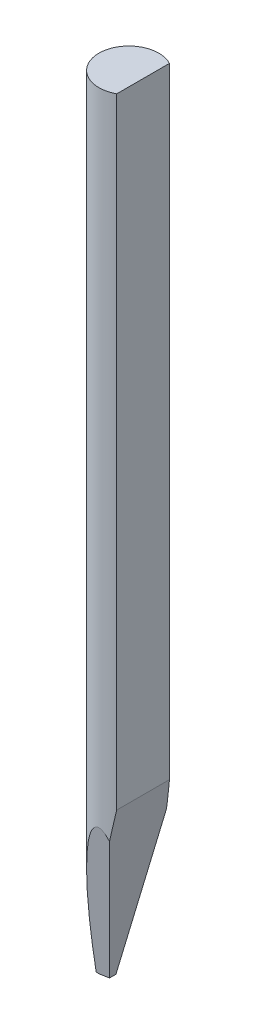
ISO-10303-21;
HEADER;
FILE_DESCRIPTION(('STEP AP214'),'2;1');
FILE_NAME('part.step','',(''),(''),'','','');
FILE_SCHEMA(('AUTOMOTIVE_DESIGN { 1 0 10303 214 1 1 1 1 }'));
ENDSEC;
DATA;
#1=APPLICATION_CONTEXT('core data for automotive mechanical design processes');
#2=APPLICATION_PROTOCOL_DEFINITION('international standard','automotive_design',2000,#1);
#3=PRODUCT_CONTEXT('',#1,'mechanical');
#4=PRODUCT('Part','Part','',(#3));
#5=PRODUCT_RELATED_PRODUCT_CATEGORY('part','',(#4));
#6=PRODUCT_DEFINITION_FORMATION('','',#4);
#7=PRODUCT_DEFINITION_CONTEXT('part definition',#1,'design');
#8=PRODUCT_DEFINITION('design','',#6,#7);
#9=PRODUCT_DEFINITION_SHAPE('','',#8);
#10=(LENGTH_UNIT() NAMED_UNIT(*) SI_UNIT(.MILLI.,.METRE.));
#11=(NAMED_UNIT(*) PLANE_ANGLE_UNIT() SI_UNIT($,.RADIAN.));
#12=(NAMED_UNIT(*) SI_UNIT($,.STERADIAN.) SOLID_ANGLE_UNIT());
#13=UNCERTAINTY_MEASURE_WITH_UNIT(LENGTH_MEASURE(1.E-05),#10,'distance_accuracy_value','');
#14=(GEOMETRIC_REPRESENTATION_CONTEXT(3) GLOBAL_UNCERTAINTY_ASSIGNED_CONTEXT((#13)) GLOBAL_UNIT_ASSIGNED_CONTEXT((#10,
#11,#12)) REPRESENTATION_CONTEXT('',''));
#15=CARTESIAN_POINT('',(0.,0.,0.));
#16=DIRECTION('',(0.,0.,1.));
#17=DIRECTION('',(1.,0.,0.));
#18=AXIS2_PLACEMENT_3D('',#15,#16,#17);
#19=CARTESIAN_POINT('',(0.,0.,0.));
#20=DIRECTION('',(0.,1.,0.));
#21=DIRECTION('',(0.,0.,1.));
#22=AXIS2_PLACEMENT_3D('',#19,#20,#21);
#23=PLANE('',#22);
#24=DIRECTION('',(0.,0.,-1.));
#25=VECTOR('',#24,1.);
#26=CARTESIAN_POINT('',(-0.71628,0.,26.4992219491216));
#27=LINE('',#26,#25);
#28=CARTESIAN_POINT('',(-0.71628,0.,0.0762));
#29=VERTEX_POINT('',#28);
#30=CARTESIAN_POINT('',(-0.71628,0.,-0.0762));
#31=VERTEX_POINT('',#30);
#32=EDGE_CURVE('E114',#29,#31,#27,.T.);
#33=ORIENTED_EDGE('',*,*,#32,.F.);
#34=DIRECTION('',(-1.,0.,0.));
#35=VECTOR('',#34,1.);
#36=CARTESIAN_POINT('',(26.8738719491216,0.,0.0762));
#37=LINE('',#36,#35);
#38=CARTESIAN_POINT('',(-0.788808031399274,0.,0.0762));
#39=VERTEX_POINT('',#38);
#40=EDGE_CURVE('E144',#29,#39,#37,.T.);
#41=ORIENTED_EDGE('',*,*,#40,.T.);
#42=CARTESIAN_POINT('',(0.,0.,0.));
#43=DIRECTION('',(0.,1.,0.));
#44=DIRECTION('',(0.,0.,1.));
#45=AXIS2_PLACEMENT_3D('',#42,#43,#44);
#46=CIRCLE('',#45,0.792479999999998);
#47=CARTESIAN_POINT('',(-0.788808031399274,0.,-0.0762));
#48=VERTEX_POINT('',#47);
#49=EDGE_CURVE('E127',#48,#39,#46,.T.);
#50=ORIENTED_EDGE('',*,*,#49,.F.);
#51=DIRECTION('',(-1.,0.,0.));
#52=VECTOR('',#51,1.);
#53=CARTESIAN_POINT('',(26.8738719491216,0.,-0.0762));
#54=LINE('',#53,#52);
#55=EDGE_CURVE('E102',#31,#48,#54,.T.);
#56=ORIENTED_EDGE('',*,*,#55,.F.);
#57=EDGE_LOOP('',(#33,#41,#50,#56));
#58=FACE_BOUND('',#57,.T.);
#59=ADVANCED_FACE('F42',(#58),#23,.F.);
#60=CARTESIAN_POINT('',(0.,21.0312,0.));
#61=DIRECTION('',(0.,-1.,0.));
#62=DIRECTION('',(0.,0.,-1.));
#63=AXIS2_PLACEMENT_3D('',#60,#61,#62);
#64=CYLINDRICAL_SURFACE('',#63,0.792479999999998);
#65=CARTESIAN_POINT('',(0.,-0.432151674654869,0.));
#66=DIRECTION('',(0.,-0.173648177666931,0.984807753012208));
#67=DIRECTION('',(0.,-0.984807753012208,-0.173648177666931));
#68=AXIS2_PLACEMENT_3D('',#65,#66,#67);
#69=ELLIPSE('',#68,4.56371043248163,0.792479999999998);
#70=CARTESIAN_POINT('',(0.241656250086243,3.84817029906569,0.754736250086248));
#71=VERTEX_POINT('',#70);
#72=EDGE_CURVE('E106',#71,#39,#69,.T.);
#73=ORIENTED_EDGE('',*,*,#72,.F.);
#74=CARTESIAN_POINT('',(0.,2.47766960135458,0.));
#75=DIRECTION('',(-0.984807753012208,0.173648177666931,0.));
#76=DIRECTION('',(-0.173648177666931,-0.984807753012208,0.));
#77=AXIS2_PLACEMENT_3D('',#74,#75,#76);
#78=ELLIPSE('',#77,4.56371043248165,0.792479999999998);
#79=CARTESIAN_POINT('',(0.37592,4.60961786298526,0.69764511322018));
#80=VERTEX_POINT('',#79);
#81=EDGE_CURVE('E58',#71,#80,#78,.T.);
#82=ORIENTED_EDGE('',*,*,#81,.T.);
#83=DIRECTION('',(0.,-1.,0.));
#84=VECTOR('',#83,1.);
#85=CARTESIAN_POINT('',(0.37592,21.0312,0.69764511322018));
#86=LINE('',#85,#84);
#87=CARTESIAN_POINT('',(0.37592,21.0312,0.69764511322018));
#88=VERTEX_POINT('',#87);
#89=EDGE_CURVE('E131',#88,#80,#86,.T.);
#90=ORIENTED_EDGE('',*,*,#89,.F.);
#91=CARTESIAN_POINT('',(0.,21.0312,0.));
#92=DIRECTION('',(0.,1.,0.));
#93=DIRECTION('',(0.,0.,1.));
#94=AXIS2_PLACEMENT_3D('',#91,#92,#93);
#95=CIRCLE('',#94,0.792479999999998);
#96=CARTESIAN_POINT('',(0.37592,21.0312,-0.69764511322018));
#97=VERTEX_POINT('',#96);
#98=EDGE_CURVE('E122',#97,#88,#95,.T.);
#99=ORIENTED_EDGE('',*,*,#98,.F.);
#100=DIRECTION('',(0.,-1.,0.));
#101=VECTOR('',#100,1.);
#102=CARTESIAN_POINT('',(0.37592,21.0312,-0.69764511322018));
#103=LINE('',#102,#101);
#104=CARTESIAN_POINT('',(0.37592,4.60961786298526,-0.69764511322018));
#105=VERTEX_POINT('',#104);
#106=EDGE_CURVE('E111',#105,#97,#103,.F.);
#107=ORIENTED_EDGE('',*,*,#106,.F.);
#108=CARTESIAN_POINT('',(0.241656250086243,3.84817029906569,-0.754736250086248));
#109=VERTEX_POINT('',#108);
#110=EDGE_CURVE('E109',#105,#109,#78,.T.);
#111=ORIENTED_EDGE('',*,*,#110,.T.);
#112=CARTESIAN_POINT('',(0.,-0.432151674654869,0.));
#113=DIRECTION('',(0.,-0.173648177666931,-0.984807753012208));
#114=DIRECTION('',(0.,-0.984807753012208,0.173648177666931));
#115=AXIS2_PLACEMENT_3D('',#112,#113,#114);
#116=ELLIPSE('',#115,4.56371043248163,0.792479999999998);
#117=EDGE_CURVE('E97',#48,#109,#116,.T.);
#118=ORIENTED_EDGE('',*,*,#117,.F.);
#119=ORIENTED_EDGE('',*,*,#49,.T.);
#120=EDGE_LOOP('',(#73,#82,#90,#99,#107,#111,#118,#119));
#121=FACE_BOUND('',#120,.T.);
#122=ADVANCED_FACE('F44',(#121),#64,.T.);
#123=CARTESIAN_POINT('',(0.37592,21.0312,0.80247998));
#124=DIRECTION('',(1.,0.,0.));
#125=DIRECTION('',(0.,0.,-1.));
#126=AXIS2_PLACEMENT_3D('',#123,#124,#125);
#127=PLANE('',#126);
#128=DIRECTION('',(0.,0.,1.));
#129=VECTOR('',#128,1.);
#130=CARTESIAN_POINT('',(0.37592,4.60961786298526,0.80247998));
#131=LINE('',#130,#129);
#132=EDGE_CURVE('E65',#105,#80,#131,.T.);
#133=ORIENTED_EDGE('',*,*,#132,.F.);
#134=ORIENTED_EDGE('',*,*,#106,.T.);
#135=DIRECTION('',(0.,0.,1.));
#136=VECTOR('',#135,1.);
#137=CARTESIAN_POINT('',(0.37592,21.0312,0.80247998));
#138=LINE('',#137,#136);
#139=EDGE_CURVE('E105',#97,#88,#138,.T.);
#140=ORIENTED_EDGE('',*,*,#139,.T.);
#141=ORIENTED_EDGE('',*,*,#89,.T.);
#142=EDGE_LOOP('',(#133,#134,#140,#141));
#143=FACE_BOUND('',#142,.T.);
#144=ADVANCED_FACE('F185',(#143),#127,.T.);
#145=CARTESIAN_POINT('',(0.,21.0312,0.));
#146=DIRECTION('',(0.,1.,0.));
#147=DIRECTION('',(0.,0.,1.));
#148=AXIS2_PLACEMENT_3D('',#145,#146,#147);
#149=PLANE('',#148);
#150=ORIENTED_EDGE('',*,*,#98,.T.);
#151=ORIENTED_EDGE('',*,*,#139,.F.);
#152=EDGE_LOOP('',(#150,#151));
#153=FACE_BOUND('',#152,.T.);
#154=ADVANCED_FACE('F178',(#153),#149,.T.);
#155=CARTESIAN_POINT('',(26.8738719491216,0.,0.0762));
#156=DIRECTION('',(0.,-0.173648177666931,0.984807753012208));
#157=DIRECTION('',(0.,-0.984807753012208,-0.173648177666931));
#158=AXIS2_PLACEMENT_3D('',#155,#156,#157);
#159=PLANE('',#158);
#160=DIRECTION('',(-0.984346441568213,-0.173566836012846,-0.0306045161452665));
#161=VECTOR('',#160,1.);
#162=CARTESIAN_POINT('',(26.016864360068,4.71377462985435,0.907365648222384));
#163=LINE('',#162,#161);
#164=CARTESIAN_POINT('',(-0.427914365185118,0.0508466417269895,0.0851656348148848));
#165=VERTEX_POINT('',#164);
#166=EDGE_CURVE('E148',#165,#29,#163,.T.);
#167=ORIENTED_EDGE('',*,*,#166,.F.);
#168=DIRECTION('',(-0.171087869746036,-0.970287525247814,-0.171087869746036));
#169=VECTOR('',#168,1.);
#170=CARTESIAN_POINT('',(0.362534636395632,4.53370569372685,0.875614636395637));
#171=LINE('',#170,#169);
#172=EDGE_CURVE('E152',#71,#165,#171,.T.);
#173=ORIENTED_EDGE('',*,*,#172,.F.);
#174=ORIENTED_EDGE('',*,*,#72,.T.);
#175=ORIENTED_EDGE('',*,*,#40,.F.);
#176=EDGE_LOOP('',(#167,#173,#174,#175));
#177=FACE_BOUND('',#176,.T.);
#178=ADVANCED_FACE('F176',(#177),#159,.T.);
#179=CARTESIAN_POINT('',(26.8738719491216,0.,-0.0762));
#180=DIRECTION('',(0.,-0.173648177666931,-0.984807753012208));
#181=DIRECTION('',(0.,0.984807753012208,-0.173648177666931));
#182=AXIS2_PLACEMENT_3D('',#179,#180,#181);
#183=PLANE('',#182);
#184=DIRECTION('',(0.984346441568213,0.173566836012846,-0.0306045161452665));
#185=VECTOR('',#184,1.);
#186=CARTESIAN_POINT('',(26.016864360068,4.71377462985435,-0.907365648222384));
#187=LINE('',#186,#185);
#188=CARTESIAN_POINT('',(-0.427914365185118,0.0508466417269895,-0.0851656348148848));
#189=VERTEX_POINT('',#188);
#190=EDGE_CURVE('E11',#31,#189,#187,.T.);
#191=ORIENTED_EDGE('',*,*,#190,.F.);
#192=ORIENTED_EDGE('',*,*,#55,.T.);
#193=ORIENTED_EDGE('',*,*,#117,.T.);
#194=DIRECTION('',(0.171087869746036,0.970287525247814,-0.171087869746036));
#195=VECTOR('',#194,1.);
#196=CARTESIAN_POINT('',(0.362534636395632,4.53370569372685,-0.875614636395637));
#197=LINE('',#196,#195);
#198=EDGE_CURVE('E51',#189,#109,#197,.T.);
#199=ORIENTED_EDGE('',*,*,#198,.F.);
#200=EDGE_LOOP('',(#191,#192,#193,#199));
#201=FACE_BOUND('',#200,.T.);
#202=ADVANCED_FACE('F99',(#201),#183,.T.);
#203=CARTESIAN_POINT('',(-0.71628,0.,26.4992219491216));
#204=DIRECTION('',(-0.173648177666931,0.984807753012208,0.));
#205=DIRECTION('',(-0.984807753012208,-0.173648177666931,0.));
#206=AXIS2_PLACEMENT_3D('',#203,#204,#205);
#207=PLANE('',#206);
#208=DIRECTION('',(0.,0.,-1.));
#209=VECTOR('',#208,1.);
#210=CARTESIAN_POINT('',(-0.427914365185115,0.0508466417269888,26.4992219491216));
#211=LINE('',#210,#209);
#212=EDGE_CURVE('E120',#165,#189,#211,.T.);
#213=ORIENTED_EDGE('',*,*,#212,.F.);
#214=ORIENTED_EDGE('',*,*,#166,.T.);
#215=ORIENTED_EDGE('',*,*,#32,.T.);
#216=ORIENTED_EDGE('',*,*,#190,.T.);
#217=EDGE_LOOP('',(#213,#214,#215,#216));
#218=FACE_BOUND('',#217,.T.);
#219=ADVANCED_FACE('F172',(#218),#207,.F.);
#220=CARTESIAN_POINT('',(-0.427914365185115,0.0508466417269888,26.4992219491216));
#221=DIRECTION('',(-0.984807753012208,0.173648177666931,0.));
#222=DIRECTION('',(-0.173648177666931,-0.984807753012208,0.));
#223=AXIS2_PLACEMENT_3D('',#220,#221,#222);
#224=PLANE('',#223);
#225=ORIENTED_EDGE('',*,*,#81,.F.);
#226=ORIENTED_EDGE('',*,*,#172,.T.);
#227=ORIENTED_EDGE('',*,*,#212,.T.);
#228=ORIENTED_EDGE('',*,*,#198,.T.);
#229=ORIENTED_EDGE('',*,*,#110,.F.);
#230=ORIENTED_EDGE('',*,*,#132,.T.);
#231=EDGE_LOOP('',(#225,#226,#227,#228,#229,#230));
#232=FACE_BOUND('',#231,.T.);
#233=ADVANCED_FACE('F117',(#232),#224,.F.);
#234=CLOSED_SHELL('',(#59,#122,#144,#154,#178,#202,#219,#233));
#235=MANIFOLD_SOLID_BREP('B2',#234);
#236=ADVANCED_BREP_SHAPE_REPRESENTATION('',(#18,#235),#14);
#237=SHAPE_DEFINITION_REPRESENTATION(#9,#236);
ENDSEC;
END-ISO-10303-21;
